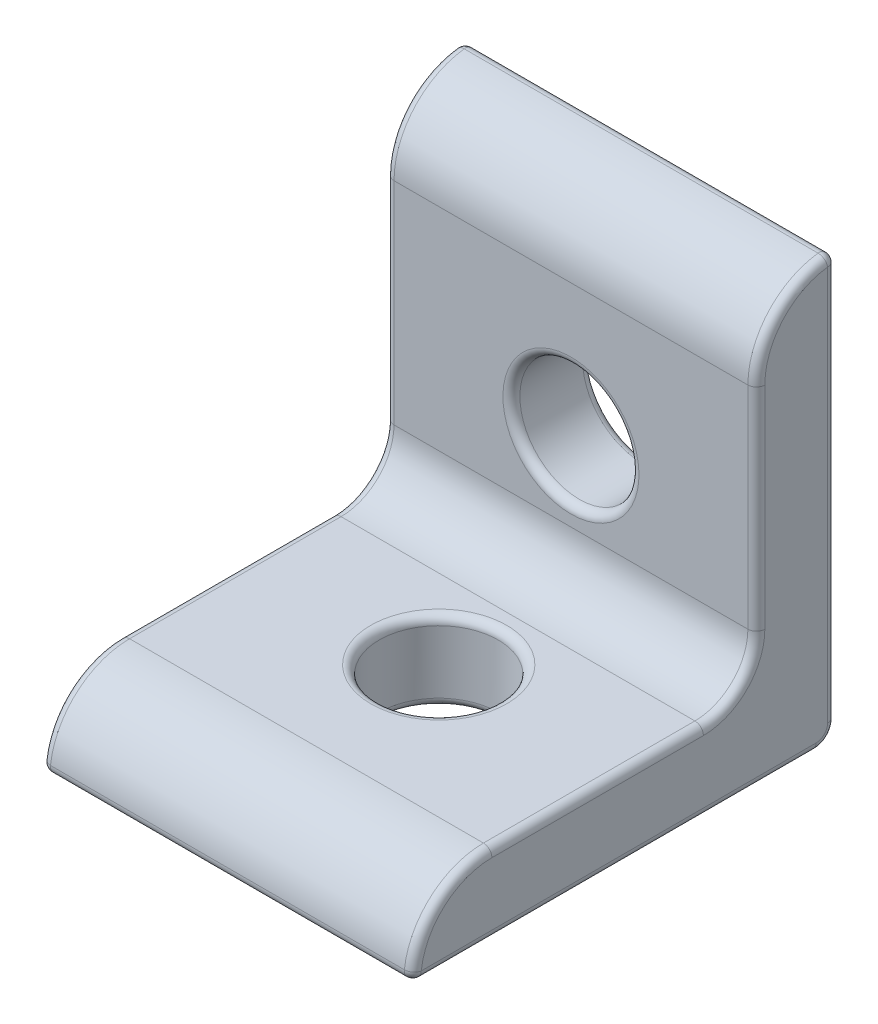
ISO-10303-21;
HEADER;
FILE_DESCRIPTION(('STEP AP214'),'2;1');
FILE_NAME('part.step','',(''),(''),'','','');
FILE_SCHEMA(('AUTOMOTIVE_DESIGN { 1 0 10303 214 1 1 1 1 }'));
ENDSEC;
DATA;
#1=APPLICATION_CONTEXT('core data for automotive mechanical design processes');
#2=APPLICATION_PROTOCOL_DEFINITION('international standard','automotive_design',2000,#1);
#3=PRODUCT_CONTEXT('',#1,'mechanical');
#4=PRODUCT('Part','Part','',(#3));
#5=PRODUCT_RELATED_PRODUCT_CATEGORY('part','',(#4));
#6=PRODUCT_DEFINITION_FORMATION('','',#4);
#7=PRODUCT_DEFINITION_CONTEXT('part definition',#1,'design');
#8=PRODUCT_DEFINITION('design','',#6,#7);
#9=PRODUCT_DEFINITION_SHAPE('','',#8);
#10=(LENGTH_UNIT() NAMED_UNIT(*) SI_UNIT(.MILLI.,.METRE.));
#11=(NAMED_UNIT(*) PLANE_ANGLE_UNIT() SI_UNIT($,.RADIAN.));
#12=(NAMED_UNIT(*) SI_UNIT($,.STERADIAN.) SOLID_ANGLE_UNIT());
#13=UNCERTAINTY_MEASURE_WITH_UNIT(LENGTH_MEASURE(1.E-05),#10,'distance_accuracy_value','');
#14=(GEOMETRIC_REPRESENTATION_CONTEXT(3) GLOBAL_UNCERTAINTY_ASSIGNED_CONTEXT((#13)) GLOBAL_UNIT_ASSIGNED_CONTEXT((#10,
#11,#12)) REPRESENTATION_CONTEXT('',''));
#15=CARTESIAN_POINT('',(0.,0.,0.));
#16=DIRECTION('',(0.,0.,1.));
#17=DIRECTION('',(1.,0.,0.));
#18=AXIS2_PLACEMENT_3D('',#15,#16,#17);
#19=CARTESIAN_POINT('',(-11.1125,-12.7,15.8496));
#20=DIRECTION('',(1.,0.,0.));
#21=DIRECTION('',(0.,0.,-1.));
#22=AXIS2_PLACEMENT_3D('',#19,#20,#21);
#23=CYLINDRICAL_SURFACE('',#22,4.7752);
#24=DIRECTION('',(1.,0.,0.));
#25=VECTOR('',#24,1.);
#26=CARTESIAN_POINT('',(-11.1125,-7.9248,15.8496));
#27=LINE('',#26,#25);
#28=CARTESIAN_POINT('',(-10.6045,-7.9248,15.8496));
#29=VERTEX_POINT('',#28);
#30=CARTESIAN_POINT('',(10.6045,-7.9248,15.8496));
#31=VERTEX_POINT('',#30);
#32=EDGE_CURVE('E214',#29,#31,#27,.T.);
#33=ORIENTED_EDGE('',*,*,#32,.F.);
#34=CARTESIAN_POINT('',(-10.6045,-12.7,15.8496));
#35=DIRECTION('',(1.,0.,0.));
#36=DIRECTION('',(0.,0.,-1.));
#37=AXIS2_PLACEMENT_3D('',#34,#35,#36);
#38=CIRCLE('',#37,4.7752);
#39=CARTESIAN_POINT('',(-10.6045,-12.1315238095238,20.5908413839481));
#40=VERTEX_POINT('',#39);
#41=EDGE_CURVE('E287',#29,#40,#38,.T.);
#42=ORIENTED_EDGE('',*,*,#41,.T.);
#43=DIRECTION('',(1.,0.,0.));
#44=VECTOR('',#43,1.);
#45=CARTESIAN_POINT('',(-11.1125,-12.1315238095238,20.5908413839481));
#46=LINE('',#45,#44);
#47=CARTESIAN_POINT('',(10.6045,-12.1315238095238,20.5908413839481));
#48=VERTEX_POINT('',#47);
#49=EDGE_CURVE('E277',#40,#48,#46,.T.);
#50=ORIENTED_EDGE('',*,*,#49,.T.);
#51=CARTESIAN_POINT('',(10.6045,-12.7,15.8496));
#52=DIRECTION('',(1.,0.,0.));
#53=DIRECTION('',(0.,0.,-1.));
#54=AXIS2_PLACEMENT_3D('',#51,#52,#53);
#55=CIRCLE('',#54,4.7752);
#56=EDGE_CURVE('E283',#48,#31,#55,.F.);
#57=ORIENTED_EDGE('',*,*,#56,.T.);
#58=EDGE_LOOP('',(#33,#42,#50,#57));
#59=FACE_BOUND('',#58,.T.);
#60=ADVANCED_FACE('F43',(#59),#23,.T.);
#61=CARTESIAN_POINT('',(-11.1125,-7.9248,3.175));
#62=DIRECTION('',(0.,1.,0.));
#63=DIRECTION('',(0.,0.,1.));
#64=AXIS2_PLACEMENT_3D('',#61,#62,#63);
#65=PLANE('',#64);
#66=CARTESIAN_POINT('',(0.,-7.9248,7.9248));
#67=DIRECTION('',(0.,1.,0.));
#68=DIRECTION('',(0.,0.,1.));
#69=AXIS2_PLACEMENT_3D('',#66,#67,#68);
#70=CIRCLE('',#69,4.0767);
#71=CARTESIAN_POINT('',(0.,-7.9248,12.0015));
#72=VERTEX_POINT('',#71);
#73=EDGE_CURVE('E420',#72,#72,#70,.F.);
#74=ORIENTED_EDGE('',*,*,#73,.T.);
#75=EDGE_LOOP('',(#74));
#76=FACE_BOUND('',#75,.T.);
#77=DIRECTION('',(1.,0.,0.));
#78=VECTOR('',#77,1.);
#79=CARTESIAN_POINT('',(-11.1125,-7.9248,3.175));
#80=LINE('',#79,#78);
#81=CARTESIAN_POINT('',(-10.6045,-7.9248,3.175));
#82=VERTEX_POINT('',#81);
#83=CARTESIAN_POINT('',(10.6045,-7.9248,3.175));
#84=VERTEX_POINT('',#83);
#85=EDGE_CURVE('E218',#82,#84,#80,.T.);
#86=ORIENTED_EDGE('',*,*,#85,.F.);
#87=DIRECTION('',(0.,0.,1.));
#88=VECTOR('',#87,1.);
#89=CARTESIAN_POINT('',(-10.6045,-7.9248,15.8496));
#90=LINE('',#89,#88);
#91=EDGE_CURVE('E291',#82,#29,#90,.T.);
#92=ORIENTED_EDGE('',*,*,#91,.T.);
#93=ORIENTED_EDGE('',*,*,#32,.T.);
#94=DIRECTION('',(0.,0.,1.));
#95=VECTOR('',#94,1.);
#96=CARTESIAN_POINT('',(10.6045,-7.9248,3.175));
#97=LINE('',#96,#95);
#98=EDGE_CURVE('E288',#31,#84,#97,.F.);
#99=ORIENTED_EDGE('',*,*,#98,.T.);
#100=EDGE_LOOP('',(#86,#92,#93,#99));
#101=FACE_BOUND('',#100,.T.);
#102=ADVANCED_FACE('F529',(#76,#101),#65,.T.);
#103=CARTESIAN_POINT('',(-11.1125,-4.7498,3.175));
#104=DIRECTION('',(1.,0.,0.));
#105=DIRECTION('',(0.,0.,-1.));
#106=AXIS2_PLACEMENT_3D('',#103,#104,#105);
#107=CYLINDRICAL_SURFACE('',#106,3.175);
#108=DIRECTION('',(1.,0.,0.));
#109=VECTOR('',#108,1.);
#110=CARTESIAN_POINT('',(-11.1125,-4.7498,0.));
#111=LINE('',#110,#109);
#112=CARTESIAN_POINT('',(-10.6045,-4.7498,0.));
#113=VERTEX_POINT('',#112);
#114=CARTESIAN_POINT('',(10.6045,-4.7498,0.));
#115=VERTEX_POINT('',#114);
#116=EDGE_CURVE('E606',#113,#115,#111,.T.);
#117=ORIENTED_EDGE('',*,*,#116,.F.);
#118=CARTESIAN_POINT('',(-10.6045,-4.7498,3.175));
#119=DIRECTION('',(1.,0.,0.));
#120=DIRECTION('',(0.,0.,-1.));
#121=AXIS2_PLACEMENT_3D('',#118,#119,#120);
#122=CIRCLE('',#121,3.175);
#123=EDGE_CURVE('E299',#113,#82,#122,.F.);
#124=ORIENTED_EDGE('',*,*,#123,.T.);
#125=ORIENTED_EDGE('',*,*,#85,.T.);
#126=CARTESIAN_POINT('',(10.6045,-4.7498,3.175));
#127=DIRECTION('',(1.,0.,0.));
#128=DIRECTION('',(0.,0.,-1.));
#129=AXIS2_PLACEMENT_3D('',#126,#127,#128);
#130=CIRCLE('',#129,3.175);
#131=EDGE_CURVE('E298',#84,#115,#130,.T.);
#132=ORIENTED_EDGE('',*,*,#131,.T.);
#133=EDGE_LOOP('',(#117,#124,#125,#132));
#134=FACE_BOUND('',#133,.T.);
#135=ADVANCED_FACE('F534',(#134),#107,.F.);
#136=CARTESIAN_POINT('',(-11.1125,7.9248,0.));
#137=DIRECTION('',(0.,0.,1.));
#138=DIRECTION('',(0.,-1.,0.));
#139=AXIS2_PLACEMENT_3D('',#136,#137,#138);
#140=PLANE('',#139);
#141=CARTESIAN_POINT('',(0.,0.,0.));
#142=DIRECTION('',(0.,0.,1.));
#143=DIRECTION('',(0.,-1.,0.));
#144=AXIS2_PLACEMENT_3D('',#141,#142,#143);
#145=CIRCLE('',#144,4.0767);
#146=CARTESIAN_POINT('',(0.,-4.0767,0.));
#147=VERTEX_POINT('',#146);
#148=EDGE_CURVE('E55',#147,#147,#145,.F.);
#149=ORIENTED_EDGE('',*,*,#148,.T.);
#150=EDGE_LOOP('',(#149));
#151=FACE_BOUND('',#150,.T.);
#152=DIRECTION('',(1.,0.,0.));
#153=VECTOR('',#152,1.);
#154=CARTESIAN_POINT('',(-11.1125,7.9248,0.));
#155=LINE('',#154,#153);
#156=CARTESIAN_POINT('',(-10.6045,7.9248,0.));
#157=VERTEX_POINT('',#156);
#158=CARTESIAN_POINT('',(10.6045,7.9248,0.));
#159=VERTEX_POINT('',#158);
#160=EDGE_CURVE('E222',#157,#159,#155,.T.);
#161=ORIENTED_EDGE('',*,*,#160,.F.);
#162=DIRECTION('',(0.,-1.,0.));
#163=VECTOR('',#162,1.);
#164=CARTESIAN_POINT('',(-10.6045,-4.7498,0.));
#165=LINE('',#164,#163);
#166=EDGE_CURVE('E304',#157,#113,#165,.T.);
#167=ORIENTED_EDGE('',*,*,#166,.T.);
#168=ORIENTED_EDGE('',*,*,#116,.T.);
#169=DIRECTION('',(0.,-1.,0.));
#170=VECTOR('',#169,1.);
#171=CARTESIAN_POINT('',(10.6045,7.9248,0.));
#172=LINE('',#171,#170);
#173=EDGE_CURVE('E305',#115,#159,#172,.F.);
#174=ORIENTED_EDGE('',*,*,#173,.T.);
#175=EDGE_LOOP('',(#161,#167,#168,#174));
#176=FACE_BOUND('',#175,.T.);
#177=ADVANCED_FACE('F432',(#151,#176),#140,.T.);
#178=CARTESIAN_POINT('',(-11.1125,7.9248,-4.7752));
#179=DIRECTION('',(1.,0.,0.));
#180=DIRECTION('',(0.,0.,-1.));
#181=AXIS2_PLACEMENT_3D('',#178,#179,#180);
#182=CYLINDRICAL_SURFACE('',#181,4.7752);
#183=DIRECTION('',(1.,0.,0.));
#184=VECTOR('',#183,1.);
#185=CARTESIAN_POINT('',(-11.1125,12.6660413839481,-4.20672380952381));
#186=LINE('',#185,#184);
#187=CARTESIAN_POINT('',(10.6045,12.6660413839481,-4.20672380952381));
#188=VERTEX_POINT('',#187);
#189=CARTESIAN_POINT('',(-10.6045,12.6660413839481,-4.20672380952381));
#190=VERTEX_POINT('',#189);
#191=EDGE_CURVE('E56',#188,#190,#186,.F.);
#192=ORIENTED_EDGE('',*,*,#191,.T.);
#193=CARTESIAN_POINT('',(-10.6045,7.9248,-4.7752));
#194=DIRECTION('',(1.,0.,0.));
#195=DIRECTION('',(0.,0.,-1.));
#196=AXIS2_PLACEMENT_3D('',#193,#194,#195);
#197=CIRCLE('',#196,4.7752);
#198=EDGE_CURVE('E322',#190,#157,#197,.T.);
#199=ORIENTED_EDGE('',*,*,#198,.T.);
#200=ORIENTED_EDGE('',*,*,#160,.T.);
#201=CARTESIAN_POINT('',(10.6045,7.9248,-4.7752));
#202=DIRECTION('',(1.,0.,0.));
#203=DIRECTION('',(0.,0.,-1.));
#204=AXIS2_PLACEMENT_3D('',#201,#202,#203);
#205=CIRCLE('',#204,4.7752);
#206=EDGE_CURVE('E63',#159,#188,#205,.F.);
#207=ORIENTED_EDGE('',*,*,#206,.T.);
#208=EDGE_LOOP('',(#192,#199,#200,#207));
#209=FACE_BOUND('',#208,.T.);
#210=ADVANCED_FACE('F460',(#209),#182,.T.);
#211=CARTESIAN_POINT('',(-11.1125,-12.7,-4.7752));
#212=DIRECTION('',(0.,0.,-1.));
#213=DIRECTION('',(-1.,0.,0.));
#214=AXIS2_PLACEMENT_3D('',#211,#212,#213);
#215=PLANE('',#214);
#216=CARTESIAN_POINT('',(0.,0.,-4.7752));
#217=DIRECTION('',(0.,0.,-1.));
#218=DIRECTION('',(-1.,0.,0.));
#219=AXIS2_PLACEMENT_3D('',#216,#217,#218);
#220=CIRCLE('',#219,4.0767);
#221=CARTESIAN_POINT('',(-4.0767,0.,-4.7752));
#222=VERTEX_POINT('',#221);
#223=EDGE_CURVE('E11',#222,#222,#220,.F.);
#224=ORIENTED_EDGE('',*,*,#223,.T.);
#225=EDGE_LOOP('',(#224));
#226=FACE_BOUND('',#225,.T.);
#227=DIRECTION('',(1.,0.,0.));
#228=VECTOR('',#227,1.);
#229=CARTESIAN_POINT('',(-11.1125,-11.5062,-4.7752));
#230=LINE('',#229,#228);
#231=CARTESIAN_POINT('',(10.6045,-11.5062,-4.7752));
#232=VERTEX_POINT('',#231);
#233=CARTESIAN_POINT('',(-10.6045,-11.5062,-4.7752));
#234=VERTEX_POINT('',#233);
#235=EDGE_CURVE('E208',#232,#234,#230,.F.);
#236=ORIENTED_EDGE('',*,*,#235,.T.);
#237=DIRECTION('',(0.,1.,0.));
#238=VECTOR('',#237,1.);
#239=CARTESIAN_POINT('',(-10.6045,12.7,-4.7752));
#240=LINE('',#239,#238);
#241=CARTESIAN_POINT('',(-10.6045,12.161654002677,-4.7752));
#242=VERTEX_POINT('',#241);
#243=EDGE_CURVE('E319',#234,#242,#240,.T.);
#244=ORIENTED_EDGE('',*,*,#243,.T.);
#245=DIRECTION('',(1.,0.,0.));
#246=VECTOR('',#245,1.);
#247=CARTESIAN_POINT('',(-11.1125,12.161654002677,-4.7752));
#248=LINE('',#247,#246);
#249=CARTESIAN_POINT('',(10.6045,12.161654002677,-4.7752));
#250=VERTEX_POINT('',#249);
#251=EDGE_CURVE('E314',#242,#250,#248,.T.);
#252=ORIENTED_EDGE('',*,*,#251,.T.);
#253=DIRECTION('',(0.,1.,0.));
#254=VECTOR('',#253,1.);
#255=CARTESIAN_POINT('',(10.6045,-12.7,-4.7752));
#256=LINE('',#255,#254);
#257=EDGE_CURVE('E315',#250,#232,#256,.F.);
#258=ORIENTED_EDGE('',*,*,#257,.T.);
#259=EDGE_LOOP('',(#236,#244,#252,#258));
#260=FACE_BOUND('',#259,.T.);
#261=ADVANCED_FACE('F453',(#226,#260),#215,.T.);
#262=CARTESIAN_POINT('',(-11.1125,-12.7,20.6248));
#263=DIRECTION('',(0.,-1.,0.));
#264=DIRECTION('',(0.,0.,-1.));
#265=AXIS2_PLACEMENT_3D('',#262,#263,#264);
#266=PLANE('',#265);
#267=CARTESIAN_POINT('',(0.,-12.7,7.9248));
#268=DIRECTION('',(0.,-1.,0.));
#269=DIRECTION('',(0.,0.,-1.));
#270=AXIS2_PLACEMENT_3D('',#267,#268,#269);
#271=CIRCLE('',#270,4.0767);
#272=CARTESIAN_POINT('',(0.,-12.7,3.8481));
#273=VERTEX_POINT('',#272);
#274=EDGE_CURVE('E201',#273,#273,#271,.F.);
#275=ORIENTED_EDGE('',*,*,#274,.T.);
#276=EDGE_LOOP('',(#275));
#277=FACE_BOUND('',#276,.T.);
#278=DIRECTION('',(1.,0.,0.));
#279=VECTOR('',#278,1.);
#280=CARTESIAN_POINT('',(-11.1125,-12.7,20.086454002677));
#281=LINE('',#280,#279);
#282=CARTESIAN_POINT('',(10.6045,-12.7,20.086454002677));
#283=VERTEX_POINT('',#282);
#284=CARTESIAN_POINT('',(-10.6045,-12.7,20.086454002677));
#285=VERTEX_POINT('',#284);
#286=EDGE_CURVE('E202',#283,#285,#281,.F.);
#287=ORIENTED_EDGE('',*,*,#286,.T.);
#288=DIRECTION('',(0.,0.,-1.));
#289=VECTOR('',#288,1.);
#290=CARTESIAN_POINT('',(-10.6045,-12.7,-3.5814));
#291=LINE('',#290,#289);
#292=CARTESIAN_POINT('',(-10.6045,-12.7,-3.5814));
#293=VERTEX_POINT('',#292);
#294=EDGE_CURVE('E172',#285,#293,#291,.T.);
#295=ORIENTED_EDGE('',*,*,#294,.T.);
#296=DIRECTION('',(1.,0.,0.));
#297=VECTOR('',#296,1.);
#298=CARTESIAN_POINT('',(-11.1125,-12.7,-3.5814));
#299=LINE('',#298,#297);
#300=CARTESIAN_POINT('',(10.6045,-12.7,-3.5814));
#301=VERTEX_POINT('',#300);
#302=EDGE_CURVE('E198',#293,#301,#299,.T.);
#303=ORIENTED_EDGE('',*,*,#302,.T.);
#304=DIRECTION('',(0.,0.,-1.));
#305=VECTOR('',#304,1.);
#306=CARTESIAN_POINT('',(10.6045,-12.7,20.6248));
#307=LINE('',#306,#305);
#308=EDGE_CURVE('E203',#301,#283,#307,.F.);
#309=ORIENTED_EDGE('',*,*,#308,.T.);
#310=EDGE_LOOP('',(#287,#295,#303,#309));
#311=FACE_BOUND('',#310,.T.);
#312=ADVANCED_FACE('F200',(#277,#311),#266,.T.);
#313=CARTESIAN_POINT('',(-11.1125,-12.7,15.8496));
#314=DIRECTION('',(1.,0.,0.));
#315=DIRECTION('',(0.,0.,-1.));
#316=AXIS2_PLACEMENT_3D('',#313,#314,#315);
#317=PLANE('',#316);
#318=CARTESIAN_POINT('',(-11.1125,-11.5062,-3.5814));
#319=DIRECTION('',(1.,0.,0.));
#320=DIRECTION('',(0.,0.,-1.));
#321=AXIS2_PLACEMENT_3D('',#318,#319,#320);
#322=CIRCLE('',#321,0.6858);
#323=CARTESIAN_POINT('',(-11.1125,-11.5062,-4.2672));
#324=VERTEX_POINT('',#323);
#325=CARTESIAN_POINT('',(-11.1125,-12.192,-3.5814));
#326=VERTEX_POINT('',#325);
#327=EDGE_CURVE('E248',#324,#326,#322,.F.);
#328=ORIENTED_EDGE('',*,*,#327,.T.);
#329=DIRECTION('',(0.,0.,-1.));
#330=VECTOR('',#329,1.);
#331=CARTESIAN_POINT('',(-11.1125,-12.192,20.6248));
#332=LINE('',#331,#330);
#333=CARTESIAN_POINT('',(-11.1125,-12.192,20.086454002677));
#334=VERTEX_POINT('',#333);
#335=EDGE_CURVE('E176',#326,#334,#332,.F.);
#336=ORIENTED_EDGE('',*,*,#335,.T.);
#337=CARTESIAN_POINT('',(-11.1125,-12.7,15.8496));
#338=DIRECTION('',(1.,0.,0.));
#339=DIRECTION('',(0.,0.,-1.));
#340=AXIS2_PLACEMENT_3D('',#337,#338,#339);
#341=CIRCLE('',#340,4.2672);
#342=CARTESIAN_POINT('',(-11.1125,-8.4328,15.8496));
#343=VERTEX_POINT('',#342);
#344=EDGE_CURVE('E246',#334,#343,#341,.F.);
#345=ORIENTED_EDGE('',*,*,#344,.T.);
#346=DIRECTION('',(0.,0.,1.));
#347=VECTOR('',#346,1.);
#348=CARTESIAN_POINT('',(-11.1125,-8.4328,3.175));
#349=LINE('',#348,#347);
#350=CARTESIAN_POINT('',(-11.1125,-8.4328,3.175));
#351=VERTEX_POINT('',#350);
#352=EDGE_CURVE('E243',#343,#351,#349,.F.);
#353=ORIENTED_EDGE('',*,*,#352,.T.);
#354=CARTESIAN_POINT('',(-11.1125,-4.7498,3.175));
#355=DIRECTION('',(1.,0.,0.));
#356=DIRECTION('',(0.,0.,-1.));
#357=AXIS2_PLACEMENT_3D('',#354,#355,#356);
#358=CIRCLE('',#357,3.683);
#359=CARTESIAN_POINT('',(-11.1125,-4.7498,-0.508000000000003));
#360=VERTEX_POINT('',#359);
#361=EDGE_CURVE('E239',#351,#360,#358,.T.);
#362=ORIENTED_EDGE('',*,*,#361,.T.);
#363=DIRECTION('',(0.,-1.,0.));
#364=VECTOR('',#363,1.);
#365=CARTESIAN_POINT('',(-11.1125,7.9248,-0.508000000000001));
#366=LINE('',#365,#364);
#367=CARTESIAN_POINT('',(-11.1125,7.9248,-0.508));
#368=VERTEX_POINT('',#367);
#369=EDGE_CURVE('E240',#360,#368,#366,.F.);
#370=ORIENTED_EDGE('',*,*,#369,.T.);
#371=CARTESIAN_POINT('',(-11.1125,7.9248,-4.7752));
#372=DIRECTION('',(1.,0.,0.));
#373=DIRECTION('',(0.,0.,-1.));
#374=AXIS2_PLACEMENT_3D('',#371,#372,#373);
#375=CIRCLE('',#374,4.2672);
#376=CARTESIAN_POINT('',(-11.1125,12.161654002677,-4.2672));
#377=VERTEX_POINT('',#376);
#378=EDGE_CURVE('E233',#368,#377,#375,.F.);
#379=ORIENTED_EDGE('',*,*,#378,.T.);
#380=DIRECTION('',(0.,1.,0.));
#381=VECTOR('',#380,1.);
#382=CARTESIAN_POINT('',(-11.1125,-11.5062,-4.2672));
#383=LINE('',#382,#381);
#384=EDGE_CURVE('E234',#377,#324,#383,.F.);
#385=ORIENTED_EDGE('',*,*,#384,.T.);
#386=EDGE_LOOP('',(#328,#336,#345,#353,#362,#370,#379,#385));
#387=FACE_BOUND('',#386,.T.);
#388=ADVANCED_FACE('F595',(#387),#317,.F.);
#389=CARTESIAN_POINT('',(11.1125,-12.7,15.8496));
#390=DIRECTION('',(1.,0.,0.));
#391=DIRECTION('',(0.,0.,-1.));
#392=AXIS2_PLACEMENT_3D('',#389,#390,#391);
#393=PLANE('',#392);
#394=CARTESIAN_POINT('',(11.1125,-12.7,15.8496));
#395=DIRECTION('',(1.,0.,0.));
#396=DIRECTION('',(0.,0.,-1.));
#397=AXIS2_PLACEMENT_3D('',#394,#395,#396);
#398=CIRCLE('',#397,4.2672);
#399=CARTESIAN_POINT('',(11.1125,-8.4328,15.8496));
#400=VERTEX_POINT('',#399);
#401=CARTESIAN_POINT('',(11.1125,-12.192,20.086454002677));
#402=VERTEX_POINT('',#401);
#403=EDGE_CURVE('E268',#400,#402,#398,.T.);
#404=ORIENTED_EDGE('',*,*,#403,.T.);
#405=DIRECTION('',(0.,0.,-1.));
#406=VECTOR('',#405,1.);
#407=CARTESIAN_POINT('',(11.1125,-12.192,15.8496));
#408=LINE('',#407,#406);
#409=CARTESIAN_POINT('',(11.1125,-12.192,-3.5814));
#410=VERTEX_POINT('',#409);
#411=EDGE_CURVE('E279',#402,#410,#408,.T.);
#412=ORIENTED_EDGE('',*,*,#411,.T.);
#413=CARTESIAN_POINT('',(11.1125,-11.5062,-3.5814));
#414=DIRECTION('',(1.,0.,0.));
#415=DIRECTION('',(0.,0.,-1.));
#416=AXIS2_PLACEMENT_3D('',#413,#414,#415);
#417=CIRCLE('',#416,0.6858);
#418=CARTESIAN_POINT('',(11.1125,-11.5062,-4.2672));
#419=VERTEX_POINT('',#418);
#420=EDGE_CURVE('E271',#410,#419,#417,.T.);
#421=ORIENTED_EDGE('',*,*,#420,.T.);
#422=DIRECTION('',(0.,1.,0.));
#423=VECTOR('',#422,1.);
#424=CARTESIAN_POINT('',(11.1125,-12.7,-4.2672));
#425=LINE('',#424,#423);
#426=CARTESIAN_POINT('',(11.1125,12.161654002677,-4.2672));
#427=VERTEX_POINT('',#426);
#428=EDGE_CURVE('E260',#419,#427,#425,.T.);
#429=ORIENTED_EDGE('',*,*,#428,.T.);
#430=CARTESIAN_POINT('',(11.1125,7.9248,-4.7752));
#431=DIRECTION('',(1.,0.,0.));
#432=DIRECTION('',(0.,0.,-1.));
#433=AXIS2_PLACEMENT_3D('',#430,#431,#432);
#434=CIRCLE('',#433,4.2672);
#435=CARTESIAN_POINT('',(11.1125,7.9248,-0.508));
#436=VERTEX_POINT('',#435);
#437=EDGE_CURVE('E191',#427,#436,#434,.T.);
#438=ORIENTED_EDGE('',*,*,#437,.T.);
#439=DIRECTION('',(0.,-1.,0.));
#440=VECTOR('',#439,1.);
#441=CARTESIAN_POINT('',(11.1125,-12.7,-0.508000000000005));
#442=LINE('',#441,#440);
#443=CARTESIAN_POINT('',(11.1125,-4.7498,-0.508000000000004));
#444=VERTEX_POINT('',#443);
#445=EDGE_CURVE('E262',#436,#444,#442,.T.);
#446=ORIENTED_EDGE('',*,*,#445,.T.);
#447=CARTESIAN_POINT('',(11.1125,-4.7498,3.175));
#448=DIRECTION('',(1.,0.,0.));
#449=DIRECTION('',(0.,0.,-1.));
#450=AXIS2_PLACEMENT_3D('',#447,#448,#449);
#451=CIRCLE('',#450,3.683);
#452=CARTESIAN_POINT('',(11.1125,-8.4328,3.175));
#453=VERTEX_POINT('',#452);
#454=EDGE_CURVE('E264',#444,#453,#451,.F.);
#455=ORIENTED_EDGE('',*,*,#454,.T.);
#456=DIRECTION('',(0.,0.,1.));
#457=VECTOR('',#456,1.);
#458=CARTESIAN_POINT('',(11.1125,-8.4328,15.8496));
#459=LINE('',#458,#457);
#460=EDGE_CURVE('E269',#453,#400,#459,.T.);
#461=ORIENTED_EDGE('',*,*,#460,.T.);
#462=EDGE_LOOP('',(#404,#412,#421,#429,#438,#446,#455,#461));
#463=FACE_BOUND('',#462,.T.);
#464=ADVANCED_FACE('F488',(#463),#393,.T.);
#465=CARTESIAN_POINT('',(-11.1125,-11.5062,-3.5814));
#466=DIRECTION('',(1.,0.,0.));
#467=DIRECTION('',(0.,0.,-1.));
#468=AXIS2_PLACEMENT_3D('',#465,#466,#467);
#469=CYLINDRICAL_SURFACE('',#468,1.1938);
#470=ORIENTED_EDGE('',*,*,#302,.F.);
#471=CARTESIAN_POINT('',(-10.6045,-11.5062,-3.5814));
#472=DIRECTION('',(1.,0.,0.));
#473=DIRECTION('',(0.,0.,-1.));
#474=AXIS2_PLACEMENT_3D('',#471,#472,#473);
#475=CIRCLE('',#474,1.1938);
#476=EDGE_CURVE('E182',#293,#234,#475,.T.);
#477=ORIENTED_EDGE('',*,*,#476,.T.);
#478=ORIENTED_EDGE('',*,*,#235,.F.);
#479=CARTESIAN_POINT('',(10.6045,-11.5062,-3.5814));
#480=DIRECTION('',(1.,0.,0.));
#481=DIRECTION('',(0.,0.,-1.));
#482=AXIS2_PLACEMENT_3D('',#479,#480,#481);
#483=CIRCLE('',#482,1.1938);
#484=EDGE_CURVE('E195',#232,#301,#483,.F.);
#485=ORIENTED_EDGE('',*,*,#484,.T.);
#486=EDGE_LOOP('',(#470,#477,#478,#485));
#487=FACE_BOUND('',#486,.T.);
#488=ADVANCED_FACE('F210',(#487),#469,.T.);
#489=CARTESIAN_POINT('',(0.,0.,-4.7752));
#490=DIRECTION('',(0.,0.,1.));
#491=DIRECTION('',(1.,0.,0.));
#492=AXIS2_PLACEMENT_3D('',#489,#490,#491);
#493=CYLINDRICAL_SURFACE('',#492,3.5687);
#494=CARTESIAN_POINT('',(0.,0.,-0.508000000000002));
#495=DIRECTION('',(0.,0.,1.));
#496=DIRECTION('',(0.,-1.,0.));
#497=AXIS2_PLACEMENT_3D('',#494,#495,#496);
#498=CIRCLE('',#497,3.5687);
#499=CARTESIAN_POINT('',(0.,-3.5687,-0.508000000000002));
#500=VERTEX_POINT('',#499);
#501=EDGE_CURVE('E428',#500,#500,#498,.T.);
#502=ORIENTED_EDGE('',*,*,#501,.T.);
#503=EDGE_LOOP('',(#502));
#504=FACE_BOUND('',#503,.T.);
#505=CARTESIAN_POINT('',(0.,0.,-4.2672));
#506=DIRECTION('',(0.,0.,-1.));
#507=DIRECTION('',(-1.,0.,0.));
#508=AXIS2_PLACEMENT_3D('',#505,#506,#507);
#509=CIRCLE('',#508,3.5687);
#510=CARTESIAN_POINT('',(-3.5687,0.,-4.2672));
#511=VERTEX_POINT('',#510);
#512=EDGE_CURVE('E422',#511,#511,#509,.T.);
#513=ORIENTED_EDGE('',*,*,#512,.T.);
#514=EDGE_LOOP('',(#513));
#515=FACE_BOUND('',#514,.T.);
#516=ADVANCED_FACE('F442',(#504,#515),#493,.F.);
#517=CARTESIAN_POINT('',(0.,-12.7,7.9248));
#518=DIRECTION('',(0.,1.,0.));
#519=DIRECTION('',(0.,0.,1.));
#520=AXIS2_PLACEMENT_3D('',#517,#518,#519);
#521=CYLINDRICAL_SURFACE('',#520,3.5687);
#522=CARTESIAN_POINT('',(0.,-8.4328,7.9248));
#523=DIRECTION('',(0.,1.,0.));
#524=DIRECTION('',(0.,0.,1.));
#525=AXIS2_PLACEMENT_3D('',#522,#523,#524);
#526=CIRCLE('',#525,3.5687);
#527=CARTESIAN_POINT('',(0.,-8.4328,11.4935));
#528=VERTEX_POINT('',#527);
#529=EDGE_CURVE('E330',#528,#528,#526,.T.);
#530=ORIENTED_EDGE('',*,*,#529,.T.);
#531=EDGE_LOOP('',(#530));
#532=FACE_BOUND('',#531,.T.);
#533=CARTESIAN_POINT('',(0.,-12.192,7.9248));
#534=DIRECTION('',(0.,-1.,0.));
#535=DIRECTION('',(0.,0.,-1.));
#536=AXIS2_PLACEMENT_3D('',#533,#534,#535);
#537=CIRCLE('',#536,3.5687);
#538=CARTESIAN_POINT('',(0.,-12.192,4.3561));
#539=VERTEX_POINT('',#538);
#540=EDGE_CURVE('E308',#539,#539,#537,.T.);
#541=ORIENTED_EDGE('',*,*,#540,.T.);
#542=EDGE_LOOP('',(#541));
#543=FACE_BOUND('',#542,.T.);
#544=ADVANCED_FACE('F447',(#532,#543),#521,.F.);
#545=CARTESIAN_POINT('',(10.6045,-12.7,-0.508000000000005));
#546=DIRECTION('',(0.,-1.,0.));
#547=DIRECTION('',(0.,0.,-1.));
#548=AXIS2_PLACEMENT_3D('',#545,#546,#547);
#549=CYLINDRICAL_SURFACE('',#548,0.508);
#550=CARTESIAN_POINT('',(10.6045,7.9248,-0.508000000000001));
#551=DIRECTION('',(0.,1.,0.));
#552=DIRECTION('',(0.,0.,1.));
#553=AXIS2_PLACEMENT_3D('',#550,#551,#552);
#554=CIRCLE('',#553,0.508);
#555=EDGE_CURVE('E406',#159,#436,#554,.T.);
#556=ORIENTED_EDGE('',*,*,#555,.F.);
#557=ORIENTED_EDGE('',*,*,#173,.F.);
#558=CARTESIAN_POINT('',(10.6045,-4.7498,-0.508000000000004));
#559=DIRECTION('',(0.,-1.,0.));
#560=DIRECTION('',(0.,0.,-1.));
#561=AXIS2_PLACEMENT_3D('',#558,#559,#560);
#562=CIRCLE('',#561,0.508);
#563=EDGE_CURVE('E412',#444,#115,#562,.T.);
#564=ORIENTED_EDGE('',*,*,#563,.F.);
#565=ORIENTED_EDGE('',*,*,#445,.F.);
#566=EDGE_LOOP('',(#556,#557,#564,#565));
#567=FACE_BOUND('',#566,.T.);
#568=ADVANCED_FACE('F490',(#567),#549,.T.);
#569=CARTESIAN_POINT('',(10.6045,-4.7498,3.175));
#570=DIRECTION('',(1.,0.,0.));
#571=DIRECTION('',(0.,0.,-1.));
#572=AXIS2_PLACEMENT_3D('',#569,#570,#571);
#573=TOROIDAL_SURFACE('',#572,3.683,0.508);
#574=ORIENTED_EDGE('',*,*,#563,.T.);
#575=ORIENTED_EDGE('',*,*,#131,.F.);
#576=CARTESIAN_POINT('',(10.6045,-8.4328,3.175));
#577=DIRECTION('',(0.,0.,1.));
#578=DIRECTION('',(1.,0.,0.));
#579=AXIS2_PLACEMENT_3D('',#576,#577,#578);
#580=CIRCLE('',#579,0.508);
#581=EDGE_CURVE('E401',#453,#84,#580,.T.);
#582=ORIENTED_EDGE('',*,*,#581,.F.);
#583=ORIENTED_EDGE('',*,*,#454,.F.);
#584=EDGE_LOOP('',(#574,#575,#582,#583));
#585=FACE_BOUND('',#584,.T.);
#586=ADVANCED_FACE('F492',(#585),#573,.T.);
#587=CARTESIAN_POINT('',(10.6045,-12.7,-4.2672));
#588=DIRECTION('',(0.,1.,0.));
#589=DIRECTION('',(0.,0.,1.));
#590=AXIS2_PLACEMENT_3D('',#587,#588,#589);
#591=CYLINDRICAL_SURFACE('',#590,0.508);
#592=CARTESIAN_POINT('',(10.6045,12.161654002677,-4.2672));
#593=DIRECTION('',(0.,1.,0.));
#594=DIRECTION('',(0.,0.,1.));
#595=AXIS2_PLACEMENT_3D('',#592,#593,#594);
#596=CIRCLE('',#595,0.508);
#597=EDGE_CURVE('E391',#427,#250,#596,.T.);
#598=ORIENTED_EDGE('',*,*,#597,.F.);
#599=ORIENTED_EDGE('',*,*,#428,.F.);
#600=CARTESIAN_POINT('',(10.6045,-11.5062,-4.2672));
#601=DIRECTION('',(0.,-1.,0.));
#602=DIRECTION('',(0.,0.,-1.));
#603=AXIS2_PLACEMENT_3D('',#600,#601,#602);
#604=CIRCLE('',#603,0.508);
#605=EDGE_CURVE('E396',#232,#419,#604,.T.);
#606=ORIENTED_EDGE('',*,*,#605,.F.);
#607=ORIENTED_EDGE('',*,*,#257,.F.);
#608=EDGE_LOOP('',(#598,#599,#606,#607));
#609=FACE_BOUND('',#608,.T.);
#610=ADVANCED_FACE('F477',(#609),#591,.T.);
#611=CARTESIAN_POINT('',(10.6045,7.9248,-4.7752));
#612=DIRECTION('',(1.,0.,0.));
#613=DIRECTION('',(0.,0.,-1.));
#614=AXIS2_PLACEMENT_3D('',#611,#612,#613);
#615=TOROIDAL_SURFACE('',#614,4.2672,0.508);
#616=ORIENTED_EDGE('',*,*,#555,.T.);
#617=ORIENTED_EDGE('',*,*,#437,.F.);
#618=CARTESIAN_POINT('',(10.6045,12.161654002677,-4.2672));
#619=DIRECTION('',(0.,0.119047619047619,-0.992888545809193));
#620=DIRECTION('',(0.,0.992888545809193,0.119047619047619));
#621=AXIS2_PLACEMENT_3D('',#618,#619,#620);
#622=CIRCLE('',#621,0.508);
#623=EDGE_CURVE('E392',#188,#427,#622,.T.);
#624=ORIENTED_EDGE('',*,*,#623,.F.);
#625=ORIENTED_EDGE('',*,*,#206,.F.);
#626=EDGE_LOOP('',(#616,#617,#624,#625));
#627=FACE_BOUND('',#626,.T.);
#628=ADVANCED_FACE('F484',(#627),#615,.T.);
#629=CARTESIAN_POINT('',(10.6045,-8.4328,15.8496));
#630=DIRECTION('',(0.,0.,1.));
#631=DIRECTION('',(1.,0.,0.));
#632=AXIS2_PLACEMENT_3D('',#629,#630,#631);
#633=CYLINDRICAL_SURFACE('',#632,0.508);
#634=ORIENTED_EDGE('',*,*,#581,.T.);
#635=ORIENTED_EDGE('',*,*,#98,.F.);
#636=CARTESIAN_POINT('',(10.6045,-8.4328,15.8496));
#637=DIRECTION('',(0.,0.,1.));
#638=DIRECTION('',(1.,0.,0.));
#639=AXIS2_PLACEMENT_3D('',#636,#637,#638);
#640=CIRCLE('',#639,0.508);
#641=EDGE_CURVE('E384',#400,#31,#640,.T.);
#642=ORIENTED_EDGE('',*,*,#641,.F.);
#643=ORIENTED_EDGE('',*,*,#460,.F.);
#644=EDGE_LOOP('',(#634,#635,#642,#643));
#645=FACE_BOUND('',#644,.T.);
#646=ADVANCED_FACE('F505',(#645),#633,.T.);
#647=CARTESIAN_POINT('',(10.6045,-11.5062,-3.5814));
#648=DIRECTION('',(1.,0.,0.));
#649=DIRECTION('',(0.,0.,-1.));
#650=AXIS2_PLACEMENT_3D('',#647,#648,#649);
#651=TOROIDAL_SURFACE('',#650,0.6858,0.508);
#652=ORIENTED_EDGE('',*,*,#605,.T.);
#653=ORIENTED_EDGE('',*,*,#420,.F.);
#654=CARTESIAN_POINT('',(10.6045,-12.192,-3.5814));
#655=DIRECTION('',(0.,0.,1.));
#656=DIRECTION('',(1.,0.,0.));
#657=AXIS2_PLACEMENT_3D('',#654,#655,#656);
#658=CIRCLE('',#657,0.508);
#659=EDGE_CURVE('E379',#301,#410,#658,.T.);
#660=ORIENTED_EDGE('',*,*,#659,.F.);
#661=ORIENTED_EDGE('',*,*,#484,.F.);
#662=EDGE_LOOP('',(#652,#653,#660,#661));
#663=FACE_BOUND('',#662,.T.);
#664=ADVANCED_FACE('F519',(#663),#651,.T.);
#665=CARTESIAN_POINT('',(10.6045,12.161654002677,-4.2672));
#666=DIRECTION('',(0.,0.,1.));
#667=DIRECTION('',(1.,0.,0.));
#668=AXIS2_PLACEMENT_3D('',#665,#666,#667);
#669=SPHERICAL_SURFACE('',#668,0.508);
#670=ORIENTED_EDGE('',*,*,#623,.T.);
#671=ORIENTED_EDGE('',*,*,#597,.T.);
#672=CARTESIAN_POINT('',(10.6045,12.161654002677,-4.2672));
#673=DIRECTION('',(1.,0.,0.));
#674=DIRECTION('',(0.,1.,0.));
#675=AXIS2_PLACEMENT_3D('',#672,#673,#674);
#676=CIRCLE('',#675,0.508);
#677=EDGE_CURVE('E376',#188,#250,#676,.F.);
#678=ORIENTED_EDGE('',*,*,#677,.F.);
#679=EDGE_LOOP('',(#670,#671,#678));
#680=FACE_BOUND('',#679,.T.);
#681=ADVANCED_FACE('F479',(#680),#669,.T.);
#682=CARTESIAN_POINT('',(-10.6045,7.9248,-0.508000000000001));
#683=DIRECTION('',(0.,1.,0.));
#684=DIRECTION('',(0.,0.,1.));
#685=AXIS2_PLACEMENT_3D('',#682,#683,#684);
#686=CYLINDRICAL_SURFACE('',#685,0.508);
#687=CARTESIAN_POINT('',(-10.6045,7.9248,-0.508000000000001));
#688=DIRECTION('',(0.,1.,0.));
#689=DIRECTION('',(0.,0.,1.));
#690=AXIS2_PLACEMENT_3D('',#687,#688,#689);
#691=CIRCLE('',#690,0.508);
#692=EDGE_CURVE('E375',#368,#157,#691,.T.);
#693=ORIENTED_EDGE('',*,*,#692,.F.);
#694=ORIENTED_EDGE('',*,*,#369,.F.);
#695=CARTESIAN_POINT('',(-10.6045,-4.7498,-0.508000000000003));
#696=DIRECTION('',(0.,-1.,0.));
#697=DIRECTION('',(0.,0.,-1.));
#698=AXIS2_PLACEMENT_3D('',#695,#696,#697);
#699=CIRCLE('',#698,0.508);
#700=EDGE_CURVE('E386',#113,#360,#699,.T.);
#701=ORIENTED_EDGE('',*,*,#700,.F.);
#702=ORIENTED_EDGE('',*,*,#166,.F.);
#703=EDGE_LOOP('',(#693,#694,#701,#702));
#704=FACE_BOUND('',#703,.T.);
#705=ADVANCED_FACE('F523',(#704),#686,.T.);
#706=CARTESIAN_POINT('',(-10.6045,-4.7498,3.175));
#707=DIRECTION('',(1.,0.,0.));
#708=DIRECTION('',(0.,0.,-1.));
#709=AXIS2_PLACEMENT_3D('',#706,#707,#708);
#710=TOROIDAL_SURFACE('',#709,3.683,0.508);
#711=ORIENTED_EDGE('',*,*,#700,.T.);
#712=ORIENTED_EDGE('',*,*,#361,.F.);
#713=CARTESIAN_POINT('',(-10.6045,-8.4328,3.175));
#714=DIRECTION('',(0.,0.,1.));
#715=DIRECTION('',(1.,0.,0.));
#716=AXIS2_PLACEMENT_3D('',#713,#714,#715);
#717=CIRCLE('',#716,0.508);
#718=EDGE_CURVE('E368',#82,#351,#717,.T.);
#719=ORIENTED_EDGE('',*,*,#718,.F.);
#720=ORIENTED_EDGE('',*,*,#123,.F.);
#721=EDGE_LOOP('',(#711,#712,#719,#720));
#722=FACE_BOUND('',#721,.T.);
#723=ADVANCED_FACE('F576',(#722),#710,.T.);
#724=CARTESIAN_POINT('',(10.6045,-12.7,15.8496));
#725=DIRECTION('',(1.,0.,0.));
#726=DIRECTION('',(0.,0.,-1.));
#727=AXIS2_PLACEMENT_3D('',#724,#725,#726);
#728=TOROIDAL_SURFACE('',#727,4.2672,0.508);
#729=ORIENTED_EDGE('',*,*,#641,.T.);
#730=ORIENTED_EDGE('',*,*,#56,.F.);
#731=CARTESIAN_POINT('',(10.6045,-12.192,20.086454002677));
#732=DIRECTION('',(0.,-0.992888545809193,0.11904761904762));
#733=DIRECTION('',(0.,-0.11904761904762,-0.992888545809193));
#734=AXIS2_PLACEMENT_3D('',#731,#732,#733);
#735=CIRCLE('',#734,0.508);
#736=EDGE_CURVE('E364',#402,#48,#735,.T.);
#737=ORIENTED_EDGE('',*,*,#736,.F.);
#738=ORIENTED_EDGE('',*,*,#403,.F.);
#739=EDGE_LOOP('',(#729,#730,#737,#738));
#740=FACE_BOUND('',#739,.T.);
#741=ADVANCED_FACE('F506',(#740),#728,.T.);
#742=CARTESIAN_POINT('',(10.6045,-12.192,15.8496));
#743=DIRECTION('',(0.,0.,-1.));
#744=DIRECTION('',(-1.,0.,0.));
#745=AXIS2_PLACEMENT_3D('',#742,#743,#744);
#746=CYLINDRICAL_SURFACE('',#745,0.508);
#747=ORIENTED_EDGE('',*,*,#659,.T.);
#748=ORIENTED_EDGE('',*,*,#411,.F.);
#749=CARTESIAN_POINT('',(10.6045,-12.192,20.086454002677));
#750=DIRECTION('',(0.,0.,1.));
#751=DIRECTION('',(1.,0.,0.));
#752=AXIS2_PLACEMENT_3D('',#749,#750,#751);
#753=CIRCLE('',#752,0.508);
#754=EDGE_CURVE('E359',#283,#402,#753,.T.);
#755=ORIENTED_EDGE('',*,*,#754,.F.);
#756=ORIENTED_EDGE('',*,*,#308,.F.);
#757=EDGE_LOOP('',(#747,#748,#755,#756));
#758=FACE_BOUND('',#757,.T.);
#759=ADVANCED_FACE('F514',(#758),#746,.T.);
#760=CARTESIAN_POINT('',(-11.1125,12.161654002677,-4.2672));
#761=DIRECTION('',(1.,0.,0.));
#762=DIRECTION('',(0.,0.,-1.));
#763=AXIS2_PLACEMENT_3D('',#760,#761,#762);
#764=CYLINDRICAL_SURFACE('',#763,0.508);
#765=ORIENTED_EDGE('',*,*,#677,.T.);
#766=ORIENTED_EDGE('',*,*,#251,.F.);
#767=CARTESIAN_POINT('',(-10.6045,12.161654002677,-4.2672));
#768=DIRECTION('',(-1.,0.,0.));
#769=DIRECTION('',(0.,0.,1.));
#770=AXIS2_PLACEMENT_3D('',#767,#768,#769);
#771=CIRCLE('',#770,0.508);
#772=EDGE_CURVE('E358',#190,#242,#771,.T.);
#773=ORIENTED_EDGE('',*,*,#772,.F.);
#774=ORIENTED_EDGE('',*,*,#191,.F.);
#775=EDGE_LOOP('',(#765,#766,#773,#774));
#776=FACE_BOUND('',#775,.T.);
#777=ADVANCED_FACE('F471',(#776),#764,.T.);
#778=CARTESIAN_POINT('',(-10.6045,7.9248,-4.7752));
#779=DIRECTION('',(1.,0.,0.));
#780=DIRECTION('',(0.,0.,-1.));
#781=AXIS2_PLACEMENT_3D('',#778,#779,#780);
#782=TOROIDAL_SURFACE('',#781,4.2672,0.508);
#783=ORIENTED_EDGE('',*,*,#692,.T.);
#784=ORIENTED_EDGE('',*,*,#198,.F.);
#785=CARTESIAN_POINT('',(-10.6045,12.161654002677,-4.2672));
#786=DIRECTION('',(0.,0.11904761904762,-0.992888545809193));
#787=DIRECTION('',(0.,0.992888545809193,0.11904761904762));
#788=AXIS2_PLACEMENT_3D('',#785,#786,#787);
#789=CIRCLE('',#788,0.508);
#790=EDGE_CURVE('E354',#377,#190,#789,.T.);
#791=ORIENTED_EDGE('',*,*,#790,.F.);
#792=ORIENTED_EDGE('',*,*,#378,.F.);
#793=EDGE_LOOP('',(#783,#784,#791,#792));
#794=FACE_BOUND('',#793,.T.);
#795=ADVANCED_FACE('F568',(#794),#782,.T.);
#796=CARTESIAN_POINT('',(-10.6045,-8.4328,3.175));
#797=DIRECTION('',(0.,0.,-1.));
#798=DIRECTION('',(-1.,0.,0.));
#799=AXIS2_PLACEMENT_3D('',#796,#797,#798);
#800=CYLINDRICAL_SURFACE('',#799,0.508);
#801=ORIENTED_EDGE('',*,*,#718,.T.);
#802=ORIENTED_EDGE('',*,*,#352,.F.);
#803=CARTESIAN_POINT('',(-10.6045,-8.4328,15.8496));
#804=DIRECTION('',(0.,0.,1.));
#805=DIRECTION('',(1.,0.,0.));
#806=AXIS2_PLACEMENT_3D('',#803,#804,#805);
#807=CIRCLE('',#806,0.508);
#808=EDGE_CURVE('E348',#29,#343,#807,.T.);
#809=ORIENTED_EDGE('',*,*,#808,.F.);
#810=ORIENTED_EDGE('',*,*,#91,.F.);
#811=EDGE_LOOP('',(#801,#802,#809,#810));
#812=FACE_BOUND('',#811,.T.);
#813=ADVANCED_FACE('F564',(#812),#800,.T.);
#814=CARTESIAN_POINT('',(10.6045,-12.192,20.086454002677));
#815=DIRECTION('',(0.,0.,1.));
#816=DIRECTION('',(1.,0.,0.));
#817=AXIS2_PLACEMENT_3D('',#814,#815,#816);
#818=SPHERICAL_SURFACE('',#817,0.508);
#819=ORIENTED_EDGE('',*,*,#754,.T.);
#820=ORIENTED_EDGE('',*,*,#736,.T.);
#821=CARTESIAN_POINT('',(10.6045,-12.192,20.086454002677));
#822=DIRECTION('',(1.,0.,0.));
#823=DIRECTION('',(0.,1.,0.));
#824=AXIS2_PLACEMENT_3D('',#821,#822,#823);
#825=CIRCLE('',#824,0.508);
#826=EDGE_CURVE('E343',#283,#48,#825,.F.);
#827=ORIENTED_EDGE('',*,*,#826,.F.);
#828=EDGE_LOOP('',(#819,#820,#827));
#829=FACE_BOUND('',#828,.T.);
#830=ADVANCED_FACE('F509',(#829),#818,.T.);
#831=CARTESIAN_POINT('',(-10.6045,12.161654002677,-4.2672));
#832=DIRECTION('',(0.,0.,1.));
#833=DIRECTION('',(1.,0.,0.));
#834=AXIS2_PLACEMENT_3D('',#831,#832,#833);
#835=SPHERICAL_SURFACE('',#834,0.508);
#836=ORIENTED_EDGE('',*,*,#790,.T.);
#837=ORIENTED_EDGE('',*,*,#772,.T.);
#838=CARTESIAN_POINT('',(-10.6045,12.161654002677,-4.2672));
#839=DIRECTION('',(0.,1.,0.));
#840=DIRECTION('',(-1.,0.,0.));
#841=AXIS2_PLACEMENT_3D('',#838,#839,#840);
#842=CIRCLE('',#841,0.508);
#843=EDGE_CURVE('E338',#377,#242,#842,.F.);
#844=ORIENTED_EDGE('',*,*,#843,.F.);
#845=EDGE_LOOP('',(#836,#837,#844));
#846=FACE_BOUND('',#845,.T.);
#847=ADVANCED_FACE('F466',(#846),#835,.T.);
#848=CARTESIAN_POINT('',(-10.6045,-12.7,15.8496));
#849=DIRECTION('',(1.,0.,0.));
#850=DIRECTION('',(0.,0.,-1.));
#851=AXIS2_PLACEMENT_3D('',#848,#849,#850);
#852=TOROIDAL_SURFACE('',#851,4.2672,0.508);
#853=ORIENTED_EDGE('',*,*,#808,.T.);
#854=ORIENTED_EDGE('',*,*,#344,.F.);
#855=CARTESIAN_POINT('',(-10.6045,-12.192,20.086454002677));
#856=DIRECTION('',(0.,-0.992888545809193,0.11904761904762));
#857=DIRECTION('',(0.,-0.11904761904762,-0.992888545809193));
#858=AXIS2_PLACEMENT_3D('',#855,#856,#857);
#859=CIRCLE('',#858,0.508);
#860=EDGE_CURVE('E337',#40,#334,#859,.T.);
#861=ORIENTED_EDGE('',*,*,#860,.F.);
#862=ORIENTED_EDGE('',*,*,#41,.F.);
#863=EDGE_LOOP('',(#853,#854,#861,#862));
#864=FACE_BOUND('',#863,.T.);
#865=ADVANCED_FACE('F558',(#864),#852,.T.);
#866=CARTESIAN_POINT('',(-11.1125,-12.192,20.086454002677));
#867=DIRECTION('',(1.,0.,0.));
#868=DIRECTION('',(0.,0.,-1.));
#869=AXIS2_PLACEMENT_3D('',#866,#867,#868);
#870=CYLINDRICAL_SURFACE('',#869,0.508);
#871=ORIENTED_EDGE('',*,*,#826,.T.);
#872=ORIENTED_EDGE('',*,*,#49,.F.);
#873=CARTESIAN_POINT('',(-10.6045,-12.192,20.086454002677));
#874=DIRECTION('',(-1.,0.,0.));
#875=DIRECTION('',(0.,0.,1.));
#876=AXIS2_PLACEMENT_3D('',#873,#874,#875);
#877=CIRCLE('',#876,0.508);
#878=EDGE_CURVE('E335',#285,#40,#877,.T.);
#879=ORIENTED_EDGE('',*,*,#878,.F.);
#880=ORIENTED_EDGE('',*,*,#286,.F.);
#881=EDGE_LOOP('',(#871,#872,#879,#880));
#882=FACE_BOUND('',#881,.T.);
#883=ADVANCED_FACE('F551',(#882),#870,.T.);
#884=CARTESIAN_POINT('',(-10.6045,-12.7,-4.2672));
#885=DIRECTION('',(0.,-1.,0.));
#886=DIRECTION('',(0.,0.,-1.));
#887=AXIS2_PLACEMENT_3D('',#884,#885,#886);
#888=CYLINDRICAL_SURFACE('',#887,0.508);
#889=ORIENTED_EDGE('',*,*,#843,.T.);
#890=ORIENTED_EDGE('',*,*,#243,.F.);
#891=CARTESIAN_POINT('',(-10.6045,-11.5062,-4.2672));
#892=DIRECTION('',(0.,-1.,0.));
#893=DIRECTION('',(0.,0.,-1.));
#894=AXIS2_PLACEMENT_3D('',#891,#892,#893);
#895=CIRCLE('',#894,0.508);
#896=EDGE_CURVE('E187',#324,#234,#895,.T.);
#897=ORIENTED_EDGE('',*,*,#896,.F.);
#898=ORIENTED_EDGE('',*,*,#384,.F.);
#899=EDGE_LOOP('',(#889,#890,#897,#898));
#900=FACE_BOUND('',#899,.T.);
#901=ADVANCED_FACE('F461',(#900),#888,.T.);
#902=CARTESIAN_POINT('',(-10.6045,-12.192,20.086454002677));
#903=DIRECTION('',(0.,0.,1.));
#904=DIRECTION('',(1.,0.,0.));
#905=AXIS2_PLACEMENT_3D('',#902,#903,#904);
#906=SPHERICAL_SURFACE('',#905,0.508);
#907=ORIENTED_EDGE('',*,*,#878,.T.);
#908=ORIENTED_EDGE('',*,*,#860,.T.);
#909=CARTESIAN_POINT('',(-10.6045,-12.192,20.086454002677));
#910=DIRECTION('',(0.,0.,1.));
#911=DIRECTION('',(0.,-1.,0.));
#912=AXIS2_PLACEMENT_3D('',#909,#910,#911);
#913=CIRCLE('',#912,0.508);
#914=EDGE_CURVE('E179',#285,#334,#913,.F.);
#915=ORIENTED_EDGE('',*,*,#914,.F.);
#916=EDGE_LOOP('',(#907,#908,#915));
#917=FACE_BOUND('',#916,.T.);
#918=ADVANCED_FACE('F549',(#917),#906,.T.);
#919=CARTESIAN_POINT('',(-10.6045,-11.5062,-3.5814));
#920=DIRECTION('',(1.,0.,0.));
#921=DIRECTION('',(0.,0.,-1.));
#922=AXIS2_PLACEMENT_3D('',#919,#920,#921);
#923=TOROIDAL_SURFACE('',#922,0.6858,0.508);
#924=ORIENTED_EDGE('',*,*,#896,.T.);
#925=ORIENTED_EDGE('',*,*,#476,.F.);
#926=CARTESIAN_POINT('',(-10.6045,-12.192,-3.5814));
#927=DIRECTION('',(0.,0.,1.));
#928=DIRECTION('',(1.,0.,0.));
#929=AXIS2_PLACEMENT_3D('',#926,#927,#928);
#930=CIRCLE('',#929,0.508);
#931=EDGE_CURVE('E167',#326,#293,#930,.T.);
#932=ORIENTED_EDGE('',*,*,#931,.F.);
#933=ORIENTED_EDGE('',*,*,#327,.F.);
#934=EDGE_LOOP('',(#924,#925,#932,#933));
#935=FACE_BOUND('',#934,.T.);
#936=ADVANCED_FACE('F183',(#935),#923,.T.);
#937=CARTESIAN_POINT('',(-10.6045,-12.192,20.6248));
#938=DIRECTION('',(0.,0.,1.));
#939=DIRECTION('',(1.,0.,0.));
#940=AXIS2_PLACEMENT_3D('',#937,#938,#939);
#941=CYLINDRICAL_SURFACE('',#940,0.508);
#942=ORIENTED_EDGE('',*,*,#914,.T.);
#943=ORIENTED_EDGE('',*,*,#335,.F.);
#944=ORIENTED_EDGE('',*,*,#931,.T.);
#945=ORIENTED_EDGE('',*,*,#294,.F.);
#946=EDGE_LOOP('',(#942,#943,#944,#945));
#947=FACE_BOUND('',#946,.T.);
#948=ADVANCED_FACE('F175',(#947),#941,.T.);
#949=CARTESIAN_POINT('',(0.,-12.192,7.9248));
#950=DIRECTION('',(0.,-1.,0.));
#951=DIRECTION('',(0.,0.,-1.));
#952=AXIS2_PLACEMENT_3D('',#949,#950,#951);
#953=TOROIDAL_SURFACE('',#952,4.0767,0.508);
#954=ORIENTED_EDGE('',*,*,#540,.F.);
#955=EDGE_LOOP('',(#954));
#956=FACE_BOUND('',#955,.T.);
#957=ORIENTED_EDGE('',*,*,#274,.F.);
#958=EDGE_LOOP('',(#957));
#959=FACE_BOUND('',#958,.T.);
#960=ADVANCED_FACE('F544',(#956,#959),#953,.T.);
#961=CARTESIAN_POINT('',(0.,-8.4328,7.9248));
#962=DIRECTION('',(0.,1.,0.));
#963=DIRECTION('',(0.,0.,1.));
#964=AXIS2_PLACEMENT_3D('',#961,#962,#963);
#965=TOROIDAL_SURFACE('',#964,4.0767,0.508);
#966=ORIENTED_EDGE('',*,*,#73,.F.);
#967=EDGE_LOOP('',(#966));
#968=FACE_BOUND('',#967,.T.);
#969=ORIENTED_EDGE('',*,*,#529,.F.);
#970=EDGE_LOOP('',(#969));
#971=FACE_BOUND('',#970,.T.);
#972=ADVANCED_FACE('F439',(#968,#971),#965,.T.);
#973=CARTESIAN_POINT('',(0.,0.,-0.508000000000002));
#974=DIRECTION('',(0.,0.,1.));
#975=DIRECTION('',(0.,-1.,0.));
#976=AXIS2_PLACEMENT_3D('',#973,#974,#975);
#977=TOROIDAL_SURFACE('',#976,4.0767,0.508);
#978=ORIENTED_EDGE('',*,*,#148,.F.);
#979=EDGE_LOOP('',(#978));
#980=FACE_BOUND('',#979,.T.);
#981=ORIENTED_EDGE('',*,*,#501,.F.);
#982=EDGE_LOOP('',(#981));
#983=FACE_BOUND('',#982,.T.);
#984=ADVANCED_FACE('F440',(#980,#983),#977,.T.);
#985=CARTESIAN_POINT('',(0.,0.,-4.2672));
#986=DIRECTION('',(0.,0.,-1.));
#987=DIRECTION('',(-1.,0.,0.));
#988=AXIS2_PLACEMENT_3D('',#985,#986,#987);
#989=TOROIDAL_SURFACE('',#988,4.0767,0.508);
#990=ORIENTED_EDGE('',*,*,#512,.F.);
#991=EDGE_LOOP('',(#990));
#992=FACE_BOUND('',#991,.T.);
#993=ORIENTED_EDGE('',*,*,#223,.F.);
#994=EDGE_LOOP('',(#993));
#995=FACE_BOUND('',#994,.T.);
#996=ADVANCED_FACE('F44',(#992,#995),#989,.T.);
#997=CLOSED_SHELL('',(#60,#102,#135,#177,#210,#261,#312,#388,#464,#488,#516,#544,#568,#586,#610,
#628,#646,#664,#681,#705,#723,#741,#759,#777,#795,#813,#830,#847,#865,#883,#901,#918,#936,#948,
#960,#972,#984,#996));
#998=MANIFOLD_SOLID_BREP('B2',#997);
#999=ADVANCED_BREP_SHAPE_REPRESENTATION('',(#18,#998),#14);
#1000=SHAPE_DEFINITION_REPRESENTATION(#9,#999);
ENDSEC;
END-ISO-10303-21;
